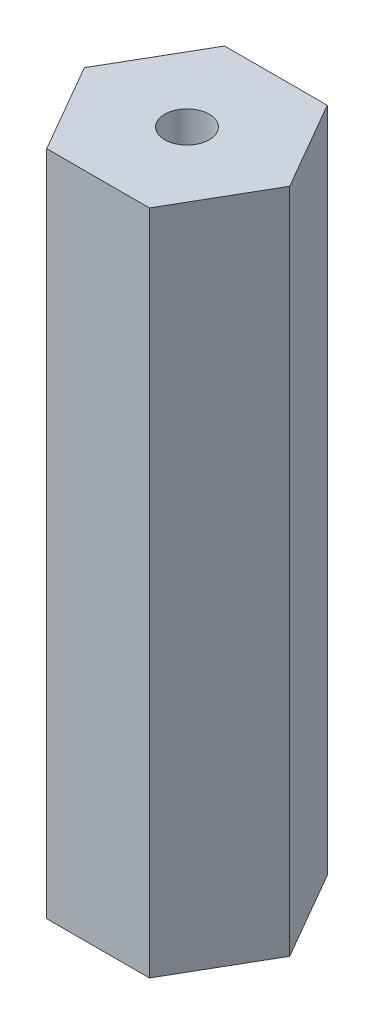
ISO-10303-21;
HEADER;
FILE_DESCRIPTION(('STEP AP214'),'2;1');
FILE_NAME('part.step','',(''),(''),'','','');
FILE_SCHEMA(('AUTOMOTIVE_DESIGN { 1 0 10303 214 1 1 1 1 }'));
ENDSEC;
DATA;
#1=APPLICATION_CONTEXT('core data for automotive mechanical design processes');
#2=APPLICATION_PROTOCOL_DEFINITION('international standard','automotive_design',2000,#1);
#3=PRODUCT_CONTEXT('',#1,'mechanical');
#4=PRODUCT('Part','Part','',(#3));
#5=PRODUCT_RELATED_PRODUCT_CATEGORY('part','',(#4));
#6=PRODUCT_DEFINITION_FORMATION('','',#4);
#7=PRODUCT_DEFINITION_CONTEXT('part definition',#1,'design');
#8=PRODUCT_DEFINITION('design','',#6,#7);
#9=PRODUCT_DEFINITION_SHAPE('','',#8);
#10=(LENGTH_UNIT() NAMED_UNIT(*) SI_UNIT(.MILLI.,.METRE.));
#11=(NAMED_UNIT(*) PLANE_ANGLE_UNIT() SI_UNIT($,.RADIAN.));
#12=(NAMED_UNIT(*) SI_UNIT($,.STERADIAN.) SOLID_ANGLE_UNIT());
#13=UNCERTAINTY_MEASURE_WITH_UNIT(LENGTH_MEASURE(1.E-05),#10,'distance_accuracy_value','');
#14=(GEOMETRIC_REPRESENTATION_CONTEXT(3) GLOBAL_UNCERTAINTY_ASSIGNED_CONTEXT((#13)) GLOBAL_UNIT_ASSIGNED_CONTEXT((#10,
#11,#12)) REPRESENTATION_CONTEXT('',''));
#15=CARTESIAN_POINT('',(0.,0.,0.));
#16=DIRECTION('',(0.,0.,1.));
#17=DIRECTION('',(1.,0.,0.));
#18=AXIS2_PLACEMENT_3D('',#15,#16,#17);
#19=CARTESIAN_POINT('',(-7.3323484187084,47.625,-12.6999999999999));
#20=DIRECTION('',(0.866025403784441,0.,0.499999999999995));
#21=DIRECTION('',(0.499999999999995,0.,-0.866025403784442));
#22=AXIS2_PLACEMENT_3D('',#19,#20,#21);
#23=PLANE('',#22);
#24=DIRECTION('',(-0.499999999999995,0.,0.866025403784442));
#25=VECTOR('',#24,1.);
#26=CARTESIAN_POINT('',(-7.3323484187084,-47.625,-12.6999999999999));
#27=LINE('',#26,#25);
#28=CARTESIAN_POINT('',(-7.3323484187084,-47.625,-12.6999999999999));
#29=VERTEX_POINT('',#28);
#30=CARTESIAN_POINT('',(-14.6646968374165,-47.625,0.));
#31=VERTEX_POINT('',#30);
#32=EDGE_CURVE('E120',#29,#31,#27,.T.);
#33=ORIENTED_EDGE('',*,*,#32,.T.);
#34=DIRECTION('',(0.,-1.,0.));
#35=VECTOR('',#34,1.);
#36=CARTESIAN_POINT('',(-14.6646968374165,47.625,0.));
#37=LINE('',#36,#35);
#38=CARTESIAN_POINT('',(-14.6646968374165,47.625,0.));
#39=VERTEX_POINT('',#38);
#40=EDGE_CURVE('E11',#39,#31,#37,.T.);
#41=ORIENTED_EDGE('',*,*,#40,.F.);
#42=DIRECTION('',(-0.499999999999995,0.,0.866025403784442));
#43=VECTOR('',#42,1.);
#44=CARTESIAN_POINT('',(-7.3323484187084,47.625,-12.6999999999999));
#45=LINE('',#44,#43);
#46=CARTESIAN_POINT('',(-7.3323484187084,47.625,-12.6999999999999));
#47=VERTEX_POINT('',#46);
#48=EDGE_CURVE('E131',#47,#39,#45,.T.);
#49=ORIENTED_EDGE('',*,*,#48,.F.);
#50=DIRECTION('',(0.,-1.,0.));
#51=VECTOR('',#50,1.);
#52=CARTESIAN_POINT('',(-7.3323484187084,47.625,-12.6999999999999));
#53=LINE('',#52,#51);
#54=EDGE_CURVE('E116',#47,#29,#53,.T.);
#55=ORIENTED_EDGE('',*,*,#54,.T.);
#56=EDGE_LOOP('',(#33,#41,#49,#55));
#57=FACE_BOUND('',#56,.T.);
#58=ADVANCED_FACE('F36',(#57),#23,.F.);
#59=CARTESIAN_POINT('',(-14.6646968374165,47.625,0.));
#60=DIRECTION('',(0.866025403784438,0.,-0.500000000000001));
#61=DIRECTION('',(-0.500000000000001,0.,-0.866025403784438));
#62=AXIS2_PLACEMENT_3D('',#59,#60,#61);
#63=PLANE('',#62);
#64=DIRECTION('',(0.500000000000001,0.,0.866025403784438));
#65=VECTOR('',#64,1.);
#66=CARTESIAN_POINT('',(-14.6646968374165,-47.625,0.));
#67=LINE('',#66,#65);
#68=CARTESIAN_POINT('',(-7.33234841870822,-47.625,12.7));
#69=VERTEX_POINT('',#68);
#70=EDGE_CURVE('E123',#31,#69,#67,.T.);
#71=ORIENTED_EDGE('',*,*,#70,.T.);
#72=DIRECTION('',(0.,-1.,0.));
#73=VECTOR('',#72,1.);
#74=CARTESIAN_POINT('',(-7.33234841870822,47.625,12.7));
#75=LINE('',#74,#73);
#76=CARTESIAN_POINT('',(-7.33234841870822,47.625,12.7));
#77=VERTEX_POINT('',#76);
#78=EDGE_CURVE('E44',#77,#69,#75,.T.);
#79=ORIENTED_EDGE('',*,*,#78,.F.);
#80=DIRECTION('',(0.500000000000001,0.,0.866025403784438));
#81=VECTOR('',#80,1.);
#82=CARTESIAN_POINT('',(-14.6646968374165,47.625,0.));
#83=LINE('',#82,#81);
#84=EDGE_CURVE('E89',#39,#77,#83,.T.);
#85=ORIENTED_EDGE('',*,*,#84,.F.);
#86=ORIENTED_EDGE('',*,*,#40,.T.);
#87=EDGE_LOOP('',(#71,#79,#85,#86));
#88=FACE_BOUND('',#87,.T.);
#89=ADVANCED_FACE('F156',(#88),#63,.F.);
#90=CARTESIAN_POINT('',(-7.33234841870822,47.625,12.7));
#91=DIRECTION('',(0.,0.,-1.));
#92=DIRECTION('',(-1.,0.,0.));
#93=AXIS2_PLACEMENT_3D('',#90,#91,#92);
#94=PLANE('',#93);
#95=DIRECTION('',(1.,0.,0.));
#96=VECTOR('',#95,1.);
#97=CARTESIAN_POINT('',(-7.33234841870822,-47.625,12.7));
#98=LINE('',#97,#96);
#99=CARTESIAN_POINT('',(7.33234841870831,-47.625,12.7));
#100=VERTEX_POINT('',#99);
#101=EDGE_CURVE('E126',#69,#100,#98,.T.);
#102=ORIENTED_EDGE('',*,*,#101,.T.);
#103=DIRECTION('',(0.,-1.,0.));
#104=VECTOR('',#103,1.);
#105=CARTESIAN_POINT('',(7.33234841870831,47.625,12.7));
#106=LINE('',#105,#104);
#107=CARTESIAN_POINT('',(7.33234841870831,47.625,12.7));
#108=VERTEX_POINT('',#107);
#109=EDGE_CURVE('E111',#108,#100,#106,.T.);
#110=ORIENTED_EDGE('',*,*,#109,.F.);
#111=DIRECTION('',(1.,0.,0.));
#112=VECTOR('',#111,1.);
#113=CARTESIAN_POINT('',(-7.33234841870822,47.625,12.7));
#114=LINE('',#113,#112);
#115=EDGE_CURVE('E102',#77,#108,#114,.T.);
#116=ORIENTED_EDGE('',*,*,#115,.F.);
#117=ORIENTED_EDGE('',*,*,#78,.T.);
#118=EDGE_LOOP('',(#102,#110,#116,#117));
#119=FACE_BOUND('',#118,.T.);
#120=ADVANCED_FACE('F137',(#119),#94,.F.);
#121=CARTESIAN_POINT('',(7.33234841870831,47.625,12.7));
#122=DIRECTION('',(-0.866025403784442,0.,-0.499999999999995));
#123=DIRECTION('',(-0.499999999999995,0.,0.866025403784442));
#124=AXIS2_PLACEMENT_3D('',#121,#122,#123);
#125=PLANE('',#124);
#126=DIRECTION('',(0.499999999999995,0.,-0.866025403784442));
#127=VECTOR('',#126,1.);
#128=CARTESIAN_POINT('',(7.33234841870831,-47.625,12.7));
#129=LINE('',#128,#127);
#130=CARTESIAN_POINT('',(14.6646968374165,-47.625,-1.02403030695263E-13));
#131=VERTEX_POINT('',#130);
#132=EDGE_CURVE('E110',#100,#131,#129,.T.);
#133=ORIENTED_EDGE('',*,*,#132,.T.);
#134=DIRECTION('',(0.,-1.,0.));
#135=VECTOR('',#134,1.);
#136=CARTESIAN_POINT('',(14.6646968374165,47.625,-1.02403030695263E-13));
#137=LINE('',#136,#135);
#138=CARTESIAN_POINT('',(14.6646968374165,47.625,-1.02403030695263E-13));
#139=VERTEX_POINT('',#138);
#140=EDGE_CURVE('E107',#139,#131,#137,.T.);
#141=ORIENTED_EDGE('',*,*,#140,.F.);
#142=DIRECTION('',(0.499999999999995,0.,-0.866025403784442));
#143=VECTOR('',#142,1.);
#144=CARTESIAN_POINT('',(7.33234841870831,47.625,12.7));
#145=LINE('',#144,#143);
#146=EDGE_CURVE('E96',#108,#139,#145,.T.);
#147=ORIENTED_EDGE('',*,*,#146,.F.);
#148=ORIENTED_EDGE('',*,*,#109,.T.);
#149=EDGE_LOOP('',(#133,#141,#147,#148));
#150=FACE_BOUND('',#149,.T.);
#151=ADVANCED_FACE('F108',(#150),#125,.F.);
#152=CARTESIAN_POINT('',(14.6646968374165,47.625,-1.02403030695263E-13));
#153=DIRECTION('',(-0.866025403784435,0.,0.500000000000007));
#154=DIRECTION('',(0.500000000000007,0.,0.866025403784435));
#155=AXIS2_PLACEMENT_3D('',#152,#153,#154);
#156=PLANE('',#155);
#157=DIRECTION('',(-0.500000000000007,0.,-0.866025403784435));
#158=VECTOR('',#157,1.);
#159=CARTESIAN_POINT('',(14.6646968374165,-47.625,-1.02403030695263E-13));
#160=LINE('',#159,#158);
#161=CARTESIAN_POINT('',(7.33234841870813,-47.625,-12.7000000000001));
#162=VERTEX_POINT('',#161);
#163=EDGE_CURVE('E75',#131,#162,#160,.T.);
#164=ORIENTED_EDGE('',*,*,#163,.T.);
#165=DIRECTION('',(0.,-1.,0.));
#166=VECTOR('',#165,1.);
#167=CARTESIAN_POINT('',(7.33234841870813,47.625,-12.7000000000001));
#168=LINE('',#167,#166);
#169=CARTESIAN_POINT('',(7.33234841870813,47.625,-12.7000000000001));
#170=VERTEX_POINT('',#169);
#171=EDGE_CURVE('E112',#170,#162,#168,.T.);
#172=ORIENTED_EDGE('',*,*,#171,.F.);
#173=DIRECTION('',(-0.500000000000007,0.,-0.866025403784435));
#174=VECTOR('',#173,1.);
#175=CARTESIAN_POINT('',(14.6646968374165,47.625,-1.02403030695263E-13));
#176=LINE('',#175,#174);
#177=EDGE_CURVE('E100',#139,#170,#176,.T.);
#178=ORIENTED_EDGE('',*,*,#177,.F.);
#179=ORIENTED_EDGE('',*,*,#140,.T.);
#180=EDGE_LOOP('',(#164,#172,#178,#179));
#181=FACE_BOUND('',#180,.T.);
#182=ADVANCED_FACE('F114',(#181),#156,.F.);
#183=CARTESIAN_POINT('',(7.33234841870813,47.625,-12.7000000000001));
#184=DIRECTION('',(0.,0.,1.));
#185=DIRECTION('',(1.,0.,0.));
#186=AXIS2_PLACEMENT_3D('',#183,#184,#185);
#187=PLANE('',#186);
#188=DIRECTION('',(-1.,0.,0.));
#189=VECTOR('',#188,1.);
#190=CARTESIAN_POINT('',(7.33234841870813,-47.625,-12.7000000000001));
#191=LINE('',#190,#189);
#192=EDGE_CURVE('E81',#162,#29,#191,.T.);
#193=ORIENTED_EDGE('',*,*,#192,.T.);
#194=ORIENTED_EDGE('',*,*,#54,.F.);
#195=DIRECTION('',(-1.,0.,0.));
#196=VECTOR('',#195,1.);
#197=CARTESIAN_POINT('',(7.33234841870813,47.625,-12.7000000000001));
#198=LINE('',#197,#196);
#199=EDGE_CURVE('E52',#170,#47,#198,.T.);
#200=ORIENTED_EDGE('',*,*,#199,.F.);
#201=ORIENTED_EDGE('',*,*,#171,.T.);
#202=EDGE_LOOP('',(#193,#194,#200,#201));
#203=FACE_BOUND('',#202,.T.);
#204=ADVANCED_FACE('F144',(#203),#187,.F.);
#205=CARTESIAN_POINT('',(0.,47.625,0.));
#206=DIRECTION('',(0.,1.,0.));
#207=DIRECTION('',(0.,0.,1.));
#208=AXIS2_PLACEMENT_3D('',#205,#206,#207);
#209=PLANE('',#208);
#210=CARTESIAN_POINT('',(0.,47.625,0.));
#211=DIRECTION('',(0.,1.,0.));
#212=DIRECTION('',(0.,0.,1.));
#213=AXIS2_PLACEMENT_3D('',#210,#211,#212);
#214=CIRCLE('',#213,3.175);
#215=CARTESIAN_POINT('',(0.,47.625,3.175));
#216=VERTEX_POINT('',#215);
#217=EDGE_CURVE('E211',#216,#216,#214,.T.);
#218=ORIENTED_EDGE('',*,*,#217,.F.);
#219=EDGE_LOOP('',(#218));
#220=FACE_BOUND('',#219,.T.);
#221=ORIENTED_EDGE('',*,*,#48,.T.);
#222=ORIENTED_EDGE('',*,*,#84,.T.);
#223=ORIENTED_EDGE('',*,*,#115,.T.);
#224=ORIENTED_EDGE('',*,*,#146,.T.);
#225=ORIENTED_EDGE('',*,*,#177,.T.);
#226=ORIENTED_EDGE('',*,*,#199,.T.);
#227=EDGE_LOOP('',(#221,#222,#223,#224,#225,#226));
#228=FACE_BOUND('',#227,.T.);
#229=ADVANCED_FACE('F98',(#220,#228),#209,.T.);
#230=CARTESIAN_POINT('',(0.,-47.625,0.));
#231=DIRECTION('',(0.,1.,0.));
#232=DIRECTION('',(0.,0.,1.));
#233=AXIS2_PLACEMENT_3D('',#230,#231,#232);
#234=PLANE('',#233);
#235=CARTESIAN_POINT('',(0.,-47.625,0.));
#236=DIRECTION('',(0.,1.,0.));
#237=DIRECTION('',(0.,0.,1.));
#238=AXIS2_PLACEMENT_3D('',#235,#236,#237);
#239=CIRCLE('',#238,3.175);
#240=CARTESIAN_POINT('',(0.,-47.625,3.175));
#241=VERTEX_POINT('',#240);
#242=EDGE_CURVE('E124',#241,#241,#239,.T.);
#243=ORIENTED_EDGE('',*,*,#242,.T.);
#244=EDGE_LOOP('',(#243));
#245=FACE_BOUND('',#244,.T.);
#246=ORIENTED_EDGE('',*,*,#32,.F.);
#247=ORIENTED_EDGE('',*,*,#192,.F.);
#248=ORIENTED_EDGE('',*,*,#163,.F.);
#249=ORIENTED_EDGE('',*,*,#132,.F.);
#250=ORIENTED_EDGE('',*,*,#101,.F.);
#251=ORIENTED_EDGE('',*,*,#70,.F.);
#252=EDGE_LOOP('',(#246,#247,#248,#249,#250,#251));
#253=FACE_BOUND('',#252,.T.);
#254=ADVANCED_FACE('F140',(#245,#253),#234,.F.);
#255=CARTESIAN_POINT('',(0.,-47.625,0.));
#256=DIRECTION('',(0.,1.,0.));
#257=DIRECTION('',(0.,0.,1.));
#258=AXIS2_PLACEMENT_3D('',#255,#256,#257);
#259=CYLINDRICAL_SURFACE('',#258,3.175);
#260=ORIENTED_EDGE('',*,*,#242,.F.);
#261=EDGE_LOOP('',(#260));
#262=FACE_BOUND('',#261,.T.);
#263=ORIENTED_EDGE('',*,*,#217,.T.);
#264=EDGE_LOOP('',(#263));
#265=FACE_BOUND('',#264,.T.);
#266=ADVANCED_FACE('F193',(#262,#265),#259,.F.);
#267=CLOSED_SHELL('',(#58,#89,#120,#151,#182,#204,#229,#254,#266));
#268=MANIFOLD_SOLID_BREP('B2',#267);
#269=ADVANCED_BREP_SHAPE_REPRESENTATION('',(#18,#268),#14);
#270=SHAPE_DEFINITION_REPRESENTATION(#9,#269);
ENDSEC;
END-ISO-10303-21;
